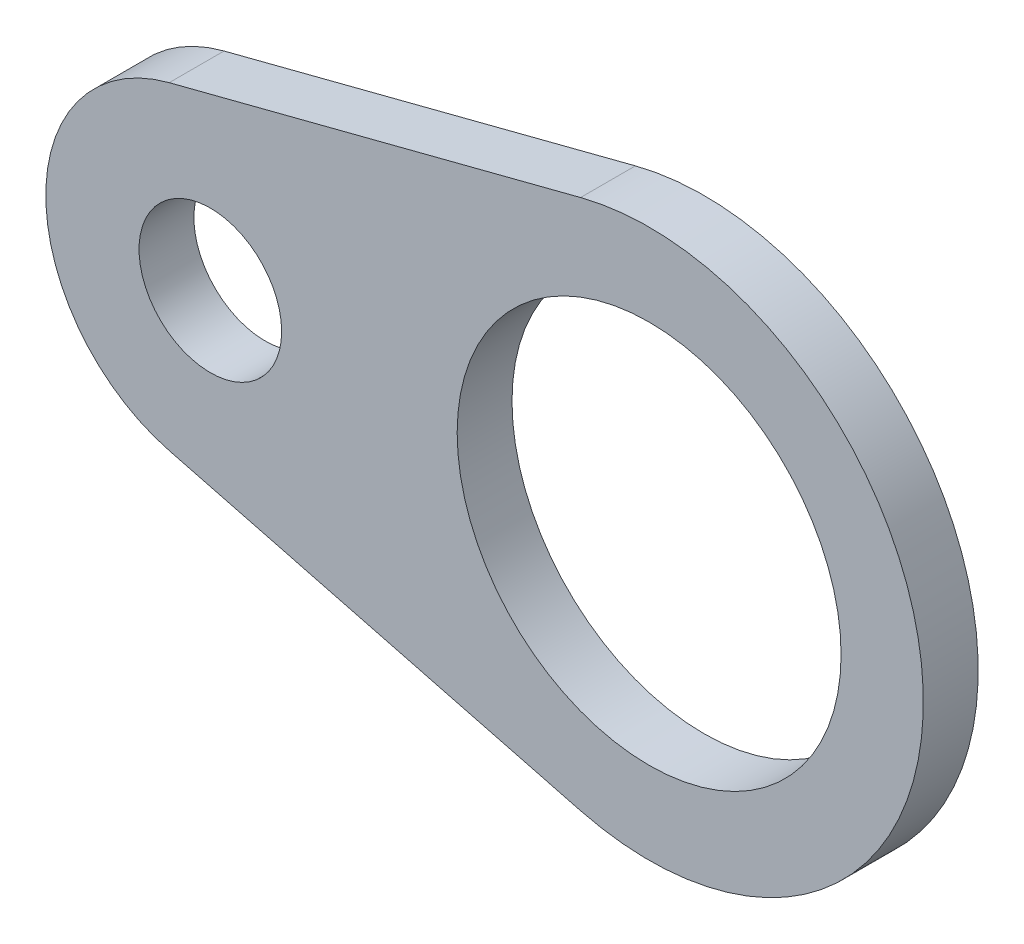
ISO-10303-21;
HEADER;
FILE_DESCRIPTION(('STEP AP214'),'2;1');
FILE_NAME('part.step','',(''),(''),'','','');
FILE_SCHEMA(('AUTOMOTIVE_DESIGN { 1 0 10303 214 1 1 1 1 }'));
ENDSEC;
DATA;
#1=APPLICATION_CONTEXT('core data for automotive mechanical design processes');
#2=APPLICATION_PROTOCOL_DEFINITION('international standard','automotive_design',2000,#1);
#3=PRODUCT_CONTEXT('',#1,'mechanical');
#4=PRODUCT('Part','Part','',(#3));
#5=PRODUCT_RELATED_PRODUCT_CATEGORY('part','',(#4));
#6=PRODUCT_DEFINITION_FORMATION('','',#4);
#7=PRODUCT_DEFINITION_CONTEXT('part definition',#1,'design');
#8=PRODUCT_DEFINITION('design','',#6,#7);
#9=PRODUCT_DEFINITION_SHAPE('','',#8);
#10=(LENGTH_UNIT() NAMED_UNIT(*) SI_UNIT(.MILLI.,.METRE.));
#11=(NAMED_UNIT(*) PLANE_ANGLE_UNIT() SI_UNIT($,.RADIAN.));
#12=(NAMED_UNIT(*) SI_UNIT($,.STERADIAN.) SOLID_ANGLE_UNIT());
#13=UNCERTAINTY_MEASURE_WITH_UNIT(LENGTH_MEASURE(1.E-05),#10,'distance_accuracy_value','');
#14=(GEOMETRIC_REPRESENTATION_CONTEXT(3) GLOBAL_UNCERTAINTY_ASSIGNED_CONTEXT((#13)) GLOBAL_UNIT_ASSIGNED_CONTEXT((#10,
#11,#12)) REPRESENTATION_CONTEXT('',''));
#15=CARTESIAN_POINT('',(0.,0.,0.));
#16=DIRECTION('',(0.,0.,1.));
#17=DIRECTION('',(1.,0.,0.));
#18=AXIS2_PLACEMENT_3D('',#15,#16,#17);
#19=CARTESIAN_POINT('',(-40.,0.,5.));
#20=DIRECTION('',(0.,0.,1.));
#21=DIRECTION('',(1.,0.,0.));
#22=AXIS2_PLACEMENT_3D('',#19,#20,#21);
#23=PLANE('',#22);
#24=CARTESIAN_POINT('',(0.,0.,5.));
#25=DIRECTION('',(0.,0.,1.));
#26=DIRECTION('',(1.,0.,0.));
#27=AXIS2_PLACEMENT_3D('',#24,#25,#26);
#28=CIRCLE('',#27,17.5);
#29=CARTESIAN_POINT('',(17.5,0.,5.));
#30=VERTEX_POINT('',#29);
#31=EDGE_CURVE('E99',#30,#30,#28,.T.);
#32=ORIENTED_EDGE('',*,*,#31,.F.);
#33=EDGE_LOOP('',(#32));
#34=FACE_BOUND('',#33,.T.);
#35=CARTESIAN_POINT('',(-40.,0.,5.));
#36=DIRECTION('',(0.,0.,1.));
#37=DIRECTION('',(1.,0.,0.));
#38=AXIS2_PLACEMENT_3D('',#35,#36,#37);
#39=CIRCLE('',#38,15.);
#40=CARTESIAN_POINT('',(-43.75,14.5236875482778,5.));
#41=VERTEX_POINT('',#40);
#42=CARTESIAN_POINT('',(-43.75,-14.5236875482778,5.));
#43=VERTEX_POINT('',#42);
#44=EDGE_CURVE('E84',#41,#43,#39,.T.);
#45=ORIENTED_EDGE('',*,*,#44,.T.);
#46=DIRECTION('',(0.968245836551854,-0.25,0.));
#47=VECTOR('',#46,1.);
#48=CARTESIAN_POINT('',(-43.75,-14.5236875482778,5.));
#49=LINE('',#48,#47);
#50=CARTESIAN_POINT('',(-6.25000000000001,-24.2061459137964,5.));
#51=VERTEX_POINT('',#50);
#52=EDGE_CURVE('E79',#43,#51,#49,.T.);
#53=ORIENTED_EDGE('',*,*,#52,.T.);
#54=CARTESIAN_POINT('',(0.,0.,5.));
#55=DIRECTION('',(0.,0.,1.));
#56=DIRECTION('',(1.,0.,0.));
#57=AXIS2_PLACEMENT_3D('',#54,#55,#56);
#58=CIRCLE('',#57,25.);
#59=CARTESIAN_POINT('',(-6.25,24.2061459137964,5.));
#60=VERTEX_POINT('',#59);
#61=EDGE_CURVE('E82',#51,#60,#58,.T.);
#62=ORIENTED_EDGE('',*,*,#61,.T.);
#63=DIRECTION('',(-0.968245836551854,-0.25,0.));
#64=VECTOR('',#63,1.);
#65=CARTESIAN_POINT('',(-43.75,14.5236875482778,5.));
#66=LINE('',#65,#64);
#67=EDGE_CURVE('E49',#60,#41,#66,.T.);
#68=ORIENTED_EDGE('',*,*,#67,.T.);
#69=EDGE_LOOP('',(#45,#53,#62,#68));
#70=FACE_BOUND('',#69,.T.);
#71=CARTESIAN_POINT('',(-40.,0.,5.));
#72=DIRECTION('',(0.,0.,1.));
#73=DIRECTION('',(1.,0.,0.));
#74=AXIS2_PLACEMENT_3D('',#71,#72,#73);
#75=CIRCLE('',#74,6.5);
#76=CARTESIAN_POINT('',(-33.5,0.,5.));
#77=VERTEX_POINT('',#76);
#78=EDGE_CURVE('E114',#77,#77,#75,.T.);
#79=ORIENTED_EDGE('',*,*,#78,.F.);
#80=EDGE_LOOP('',(#79));
#81=FACE_BOUND('',#80,.T.);
#82=ADVANCED_FACE('F32',(#34,#70,#81),#23,.T.);
#83=CARTESIAN_POINT('',(-40.,0.,0.));
#84=DIRECTION('',(0.,0.,1.));
#85=DIRECTION('',(1.,0.,0.));
#86=AXIS2_PLACEMENT_3D('',#83,#84,#85);
#87=PLANE('',#86);
#88=CARTESIAN_POINT('',(-40.,0.,0.));
#89=DIRECTION('',(0.,0.,1.));
#90=DIRECTION('',(1.,0.,0.));
#91=AXIS2_PLACEMENT_3D('',#88,#89,#90);
#92=CIRCLE('',#91,15.);
#93=CARTESIAN_POINT('',(-43.75,14.5236875482778,0.));
#94=VERTEX_POINT('',#93);
#95=CARTESIAN_POINT('',(-43.75,-14.5236875482778,0.));
#96=VERTEX_POINT('',#95);
#97=EDGE_CURVE('E96',#94,#96,#92,.T.);
#98=ORIENTED_EDGE('',*,*,#97,.F.);
#99=DIRECTION('',(-0.968245836551854,-0.25,0.));
#100=VECTOR('',#99,1.);
#101=CARTESIAN_POINT('',(-43.75,14.5236875482778,0.));
#102=LINE('',#101,#100);
#103=CARTESIAN_POINT('',(-6.25,24.2061459137964,0.));
#104=VERTEX_POINT('',#103);
#105=EDGE_CURVE('E72',#104,#94,#102,.T.);
#106=ORIENTED_EDGE('',*,*,#105,.F.);
#107=CARTESIAN_POINT('',(0.,0.,0.));
#108=DIRECTION('',(0.,0.,1.));
#109=DIRECTION('',(1.,0.,0.));
#110=AXIS2_PLACEMENT_3D('',#107,#108,#109);
#111=CIRCLE('',#110,25.);
#112=CARTESIAN_POINT('',(-6.25000000000001,-24.2061459137964,0.));
#113=VERTEX_POINT('',#112);
#114=EDGE_CURVE('E66',#113,#104,#111,.T.);
#115=ORIENTED_EDGE('',*,*,#114,.F.);
#116=DIRECTION('',(0.968245836551854,-0.25,0.));
#117=VECTOR('',#116,1.);
#118=CARTESIAN_POINT('',(-43.75,-14.5236875482778,0.));
#119=LINE('',#118,#117);
#120=EDGE_CURVE('E88',#96,#113,#119,.T.);
#121=ORIENTED_EDGE('',*,*,#120,.F.);
#122=EDGE_LOOP('',(#98,#106,#115,#121));
#123=FACE_BOUND('',#122,.T.);
#124=CARTESIAN_POINT('',(0.,0.,0.));
#125=DIRECTION('',(0.,0.,1.));
#126=DIRECTION('',(1.,0.,0.));
#127=AXIS2_PLACEMENT_3D('',#124,#125,#126);
#128=CIRCLE('',#127,17.5);
#129=CARTESIAN_POINT('',(17.5,0.,0.));
#130=VERTEX_POINT('',#129);
#131=EDGE_CURVE('E111',#130,#130,#128,.T.);
#132=ORIENTED_EDGE('',*,*,#131,.T.);
#133=EDGE_LOOP('',(#132));
#134=FACE_BOUND('',#133,.T.);
#135=CARTESIAN_POINT('',(-40.,0.,0.));
#136=DIRECTION('',(0.,0.,1.));
#137=DIRECTION('',(1.,0.,0.));
#138=AXIS2_PLACEMENT_3D('',#135,#136,#137);
#139=CIRCLE('',#138,6.5);
#140=CARTESIAN_POINT('',(-33.5,0.,0.));
#141=VERTEX_POINT('',#140);
#142=EDGE_CURVE('E117',#141,#141,#139,.T.);
#143=ORIENTED_EDGE('',*,*,#142,.T.);
#144=EDGE_LOOP('',(#143));
#145=FACE_BOUND('',#144,.T.);
#146=ADVANCED_FACE('F107',(#123,#134,#145),#87,.F.);
#147=CARTESIAN_POINT('',(-40.,0.,5.));
#148=DIRECTION('',(0.,0.,-1.));
#149=DIRECTION('',(-1.,0.,0.));
#150=AXIS2_PLACEMENT_3D('',#147,#148,#149);
#151=CYLINDRICAL_SURFACE('',#150,15.);
#152=ORIENTED_EDGE('',*,*,#97,.T.);
#153=DIRECTION('',(0.,0.,-1.));
#154=VECTOR('',#153,1.);
#155=CARTESIAN_POINT('',(-43.75,-14.5236875482778,5.));
#156=LINE('',#155,#154);
#157=EDGE_CURVE('E11',#43,#96,#156,.T.);
#158=ORIENTED_EDGE('',*,*,#157,.F.);
#159=ORIENTED_EDGE('',*,*,#44,.F.);
#160=DIRECTION('',(0.,0.,-1.));
#161=VECTOR('',#160,1.);
#162=CARTESIAN_POINT('',(-43.75,14.5236875482778,5.));
#163=LINE('',#162,#161);
#164=EDGE_CURVE('E92',#41,#94,#163,.T.);
#165=ORIENTED_EDGE('',*,*,#164,.T.);
#166=EDGE_LOOP('',(#152,#158,#159,#165));
#167=FACE_BOUND('',#166,.T.);
#168=ADVANCED_FACE('F34',(#167),#151,.T.);
#169=CARTESIAN_POINT('',(-43.75,-14.5236875482778,5.));
#170=DIRECTION('',(0.25,0.968245836551854,0.));
#171=DIRECTION('',(-0.968245836551854,0.25,0.));
#172=AXIS2_PLACEMENT_3D('',#169,#170,#171);
#173=PLANE('',#172);
#174=ORIENTED_EDGE('',*,*,#120,.T.);
#175=DIRECTION('',(0.,0.,-1.));
#176=VECTOR('',#175,1.);
#177=CARTESIAN_POINT('',(-6.25000000000001,-24.2061459137964,5.));
#178=LINE('',#177,#176);
#179=EDGE_CURVE('E41',#51,#113,#178,.T.);
#180=ORIENTED_EDGE('',*,*,#179,.F.);
#181=ORIENTED_EDGE('',*,*,#52,.F.);
#182=ORIENTED_EDGE('',*,*,#157,.T.);
#183=EDGE_LOOP('',(#174,#180,#181,#182));
#184=FACE_BOUND('',#183,.T.);
#185=ADVANCED_FACE('F87',(#184),#173,.F.);
#186=CARTESIAN_POINT('',(0.,0.,5.));
#187=DIRECTION('',(0.,0.,-1.));
#188=DIRECTION('',(-1.,0.,0.));
#189=AXIS2_PLACEMENT_3D('',#186,#187,#188);
#190=CYLINDRICAL_SURFACE('',#189,25.);
#191=ORIENTED_EDGE('',*,*,#114,.T.);
#192=DIRECTION('',(0.,0.,-1.));
#193=VECTOR('',#192,1.);
#194=CARTESIAN_POINT('',(-6.25,24.2061459137964,5.));
#195=LINE('',#194,#193);
#196=EDGE_CURVE('E89',#60,#104,#195,.T.);
#197=ORIENTED_EDGE('',*,*,#196,.F.);
#198=ORIENTED_EDGE('',*,*,#61,.F.);
#199=ORIENTED_EDGE('',*,*,#179,.T.);
#200=EDGE_LOOP('',(#191,#197,#198,#199));
#201=FACE_BOUND('',#200,.T.);
#202=ADVANCED_FACE('F90',(#201),#190,.T.);
#203=CARTESIAN_POINT('',(-43.75,14.5236875482778,5.));
#204=DIRECTION('',(0.25,-0.968245836551854,0.));
#205=DIRECTION('',(0.968245836551854,0.25,0.));
#206=AXIS2_PLACEMENT_3D('',#203,#204,#205);
#207=PLANE('',#206);
#208=ORIENTED_EDGE('',*,*,#105,.T.);
#209=ORIENTED_EDGE('',*,*,#164,.F.);
#210=ORIENTED_EDGE('',*,*,#67,.F.);
#211=ORIENTED_EDGE('',*,*,#196,.T.);
#212=EDGE_LOOP('',(#208,#209,#210,#211));
#213=FACE_BOUND('',#212,.T.);
#214=ADVANCED_FACE('F104',(#213),#207,.F.);
#215=CARTESIAN_POINT('',(0.,0.,5.));
#216=DIRECTION('',(0.,0.,-1.));
#217=DIRECTION('',(-1.,0.,0.));
#218=AXIS2_PLACEMENT_3D('',#215,#216,#217);
#219=CYLINDRICAL_SURFACE('',#218,17.5);
#220=ORIENTED_EDGE('',*,*,#31,.T.);
#221=EDGE_LOOP('',(#220));
#222=FACE_BOUND('',#221,.T.);
#223=ORIENTED_EDGE('',*,*,#131,.F.);
#224=EDGE_LOOP('',(#223));
#225=FACE_BOUND('',#224,.T.);
#226=ADVANCED_FACE('F134',(#222,#225),#219,.F.);
#227=CARTESIAN_POINT('',(-40.,0.,5.));
#228=DIRECTION('',(0.,0.,-1.));
#229=DIRECTION('',(-1.,0.,0.));
#230=AXIS2_PLACEMENT_3D('',#227,#228,#229);
#231=CYLINDRICAL_SURFACE('',#230,6.5);
#232=ORIENTED_EDGE('',*,*,#78,.T.);
#233=EDGE_LOOP('',(#232));
#234=FACE_BOUND('',#233,.T.);
#235=ORIENTED_EDGE('',*,*,#142,.F.);
#236=EDGE_LOOP('',(#235));
#237=FACE_BOUND('',#236,.T.);
#238=ADVANCED_FACE('F123',(#234,#237),#231,.F.);
#239=CLOSED_SHELL('',(#82,#146,#168,#185,#202,#214,#226,#238));
#240=MANIFOLD_SOLID_BREP('B2',#239);
#241=ADVANCED_BREP_SHAPE_REPRESENTATION('',(#18,#240),#14);
#242=SHAPE_DEFINITION_REPRESENTATION(#9,#241);
ENDSEC;
END-ISO-10303-21;
